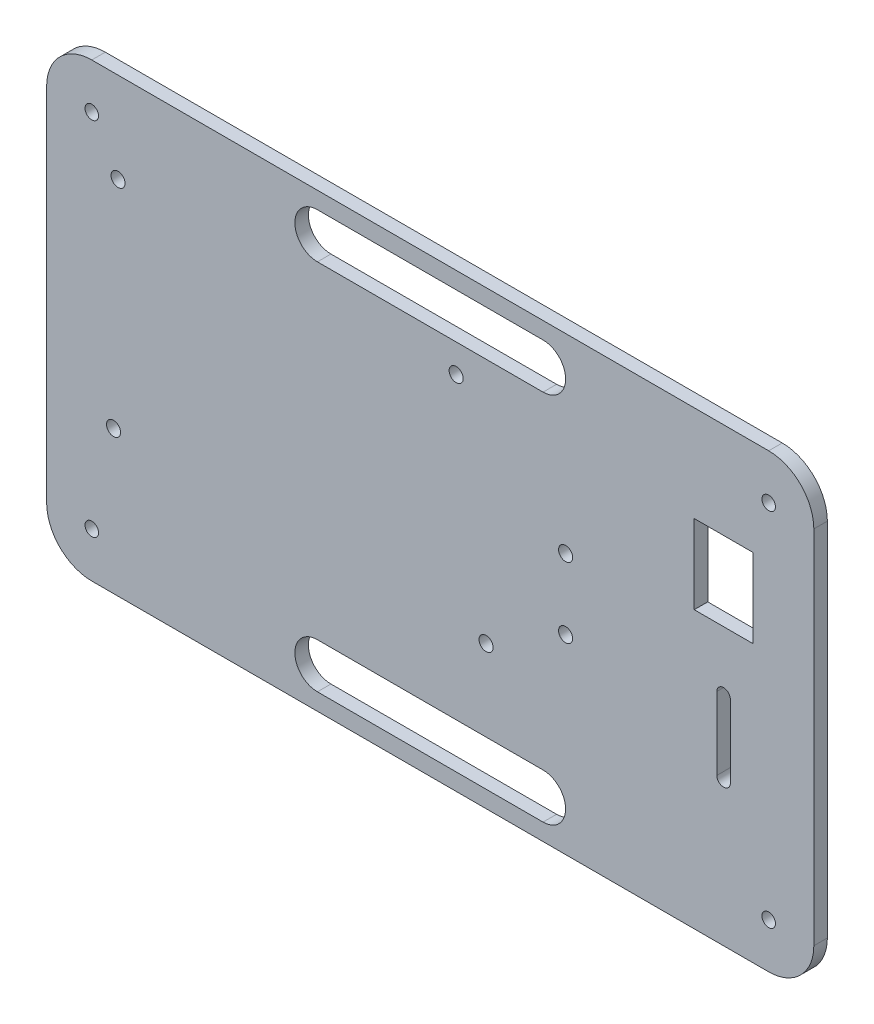
ISO-10303-21;
HEADER;
FILE_DESCRIPTION(('STEP AP214'),'2;1');
FILE_NAME('part.step','',(''),(''),'','','');
FILE_SCHEMA(('AUTOMOTIVE_DESIGN { 1 0 10303 214 1 1 1 1 }'));
ENDSEC;
DATA;
#1=APPLICATION_CONTEXT('core data for automotive mechanical design processes');
#2=APPLICATION_PROTOCOL_DEFINITION('international standard','automotive_design',2000,#1);
#3=PRODUCT_CONTEXT('',#1,'mechanical');
#4=PRODUCT('Part','Part','',(#3));
#5=PRODUCT_RELATED_PRODUCT_CATEGORY('part','',(#4));
#6=PRODUCT_DEFINITION_FORMATION('','',#4);
#7=PRODUCT_DEFINITION_CONTEXT('part definition',#1,'design');
#8=PRODUCT_DEFINITION('design','',#6,#7);
#9=PRODUCT_DEFINITION_SHAPE('','',#8);
#10=(LENGTH_UNIT() NAMED_UNIT(*) SI_UNIT(.MILLI.,.METRE.));
#11=(NAMED_UNIT(*) PLANE_ANGLE_UNIT() SI_UNIT($,.RADIAN.));
#12=(NAMED_UNIT(*) SI_UNIT($,.STERADIAN.) SOLID_ANGLE_UNIT());
#13=UNCERTAINTY_MEASURE_WITH_UNIT(LENGTH_MEASURE(1.E-05),#10,'distance_accuracy_value','');
#14=(GEOMETRIC_REPRESENTATION_CONTEXT(3) GLOBAL_UNCERTAINTY_ASSIGNED_CONTEXT((#13)) GLOBAL_UNIT_ASSIGNED_CONTEXT((#10,
#11,#12)) REPRESENTATION_CONTEXT('',''));
#15=CARTESIAN_POINT('',(0.,0.,0.));
#16=DIRECTION('',(0.,0.,1.));
#17=DIRECTION('',(1.,0.,0.));
#18=AXIS2_PLACEMENT_3D('',#15,#16,#17);
#19=CARTESIAN_POINT('',(75.,40.,3.));
#20=DIRECTION('',(0.,0.,-1.));
#21=DIRECTION('',(-1.,0.,0.));
#22=AXIS2_PLACEMENT_3D('',#19,#20,#21);
#23=PLANE('',#22);
#24=DIRECTION('',(0.,1.,0.));
#25=VECTOR('',#24,1.);
#26=CARTESIAN_POINT('',(71.5,28.75,3.));
#27=LINE('',#26,#25);
#28=CARTESIAN_POINT('',(71.5,11.25,3.));
#29=VERTEX_POINT('',#28);
#30=CARTESIAN_POINT('',(71.5,28.75,3.));
#31=VERTEX_POINT('',#30);
#32=EDGE_CURVE('E232',#29,#31,#27,.T.);
#33=ORIENTED_EDGE('',*,*,#32,.F.);
#34=DIRECTION('',(1.,0.,0.));
#35=VECTOR('',#34,1.);
#36=CARTESIAN_POINT('',(58.5,11.25,3.));
#37=LINE('',#36,#35);
#38=CARTESIAN_POINT('',(58.5,11.25,3.));
#39=VERTEX_POINT('',#38);
#40=EDGE_CURVE('E240',#39,#29,#37,.T.);
#41=ORIENTED_EDGE('',*,*,#40,.F.);
#42=DIRECTION('',(0.,-1.,0.));
#43=VECTOR('',#42,1.);
#44=CARTESIAN_POINT('',(58.5,28.75,3.));
#45=LINE('',#44,#43);
#46=CARTESIAN_POINT('',(58.5,28.75,3.));
#47=VERTEX_POINT('',#46);
#48=EDGE_CURVE('E237',#47,#39,#45,.T.);
#49=ORIENTED_EDGE('',*,*,#48,.F.);
#50=DIRECTION('',(-1.,0.,0.));
#51=VECTOR('',#50,1.);
#52=CARTESIAN_POINT('',(58.5,28.75,3.));
#53=LINE('',#52,#51);
#54=EDGE_CURVE('E234',#31,#47,#53,.T.);
#55=ORIENTED_EDGE('',*,*,#54,.F.);
#56=EDGE_LOOP('',(#33,#41,#49,#55));
#57=FACE_BOUND('',#56,.T.);
#58=CARTESIAN_POINT('',(-25.,41.2578299056687,3.));
#59=DIRECTION('',(0.,0.,1.));
#60=DIRECTION('',(1.,0.,0.));
#61=AXIS2_PLACEMENT_3D('',#58,#59,#60);
#62=CIRCLE('',#61,5.00000000000002);
#63=CARTESIAN_POINT('',(-25.,46.2578299056687,3.));
#64=VERTEX_POINT('',#63);
#65=CARTESIAN_POINT('',(-25.,36.2578299056687,3.));
#66=VERTEX_POINT('',#65);
#67=EDGE_CURVE('E330',#64,#66,#62,.T.);
#68=ORIENTED_EDGE('',*,*,#67,.F.);
#69=DIRECTION('',(-1.,0.,0.));
#70=VECTOR('',#69,1.);
#71=CARTESIAN_POINT('',(-25.,46.2578299056687,3.));
#72=LINE('',#71,#70);
#73=CARTESIAN_POINT('',(25.,46.2578299056687,3.));
#74=VERTEX_POINT('',#73);
#75=EDGE_CURVE('E338',#74,#64,#72,.T.);
#76=ORIENTED_EDGE('',*,*,#75,.F.);
#77=CARTESIAN_POINT('',(25.,41.2578299056687,3.));
#78=DIRECTION('',(0.,0.,1.));
#79=DIRECTION('',(1.,0.,0.));
#80=AXIS2_PLACEMENT_3D('',#77,#78,#79);
#81=CIRCLE('',#80,5.00000000000002);
#82=CARTESIAN_POINT('',(25.,36.2578299056687,3.));
#83=VERTEX_POINT('',#82);
#84=EDGE_CURVE('E335',#83,#74,#81,.T.);
#85=ORIENTED_EDGE('',*,*,#84,.F.);
#86=DIRECTION('',(1.,0.,0.));
#87=VECTOR('',#86,1.);
#88=CARTESIAN_POINT('',(-25.,36.2578299056687,3.));
#89=LINE('',#88,#87);
#90=EDGE_CURVE('E332',#66,#83,#89,.T.);
#91=ORIENTED_EDGE('',*,*,#90,.F.);
#92=EDGE_LOOP('',(#68,#76,#85,#91));
#93=FACE_BOUND('',#92,.T.);
#94=CARTESIAN_POINT('',(75.,40.,3.));
#95=DIRECTION('',(0.,0.,1.));
#96=DIRECTION('',(-1.,0.,0.));
#97=AXIS2_PLACEMENT_3D('',#94,#95,#96);
#98=CIRCLE('',#97,10.);
#99=CARTESIAN_POINT('',(85.,39.9999999999999,3.));
#100=VERTEX_POINT('',#99);
#101=CARTESIAN_POINT('',(74.9999999999999,50.,3.));
#102=VERTEX_POINT('',#101);
#103=EDGE_CURVE('E361',#100,#102,#98,.T.);
#104=ORIENTED_EDGE('',*,*,#103,.T.);
#105=DIRECTION('',(-1.,0.,0.));
#106=VECTOR('',#105,1.);
#107=CARTESIAN_POINT('',(-74.9999999999999,50.,3.));
#108=LINE('',#107,#106);
#109=CARTESIAN_POINT('',(-74.9999999999999,50.,3.));
#110=VERTEX_POINT('',#109);
#111=EDGE_CURVE('E364',#102,#110,#108,.T.);
#112=ORIENTED_EDGE('',*,*,#111,.T.);
#113=CARTESIAN_POINT('',(-75.,40.,3.));
#114=DIRECTION('',(0.,0.,1.));
#115=DIRECTION('',(1.,0.,0.));
#116=AXIS2_PLACEMENT_3D('',#113,#114,#115);
#117=CIRCLE('',#116,10.);
#118=CARTESIAN_POINT('',(-85.,39.9999999999999,3.));
#119=VERTEX_POINT('',#118);
#120=EDGE_CURVE('E367',#110,#119,#117,.T.);
#121=ORIENTED_EDGE('',*,*,#120,.T.);
#122=DIRECTION('',(0.,-1.,0.));
#123=VECTOR('',#122,1.);
#124=CARTESIAN_POINT('',(-85.,39.9999999999999,3.));
#125=LINE('',#124,#123);
#126=CARTESIAN_POINT('',(-85.,-39.9999999999999,3.));
#127=VERTEX_POINT('',#126);
#128=EDGE_CURVE('E369',#119,#127,#125,.T.);
#129=ORIENTED_EDGE('',*,*,#128,.T.);
#130=CARTESIAN_POINT('',(-75.,-40.,3.));
#131=DIRECTION('',(0.,0.,1.));
#132=DIRECTION('',(-1.,0.,0.));
#133=AXIS2_PLACEMENT_3D('',#130,#131,#132);
#134=CIRCLE('',#133,10.);
#135=CARTESIAN_POINT('',(-74.9999999999999,-50.,3.));
#136=VERTEX_POINT('',#135);
#137=EDGE_CURVE('E371',#127,#136,#134,.T.);
#138=ORIENTED_EDGE('',*,*,#137,.T.);
#139=DIRECTION('',(1.,0.,0.));
#140=VECTOR('',#139,1.);
#141=CARTESIAN_POINT('',(-74.9999999999999,-50.,3.));
#142=LINE('',#141,#140);
#143=CARTESIAN_POINT('',(74.9999999999999,-50.,3.));
#144=VERTEX_POINT('',#143);
#145=EDGE_CURVE('E373',#136,#144,#142,.T.);
#146=ORIENTED_EDGE('',*,*,#145,.T.);
#147=CARTESIAN_POINT('',(75.,-40.,3.));
#148=DIRECTION('',(0.,0.,1.));
#149=DIRECTION('',(-1.,0.,0.));
#150=AXIS2_PLACEMENT_3D('',#147,#148,#149);
#151=CIRCLE('',#150,10.);
#152=CARTESIAN_POINT('',(85.,-39.9999999999999,3.));
#153=VERTEX_POINT('',#152);
#154=EDGE_CURVE('E375',#144,#153,#151,.T.);
#155=ORIENTED_EDGE('',*,*,#154,.T.);
#156=DIRECTION('',(0.,1.,0.));
#157=VECTOR('',#156,1.);
#158=CARTESIAN_POINT('',(85.,39.9999999999999,3.));
#159=LINE('',#158,#157);
#160=EDGE_CURVE('E377',#153,#100,#159,.T.);
#161=ORIENTED_EDGE('',*,*,#160,.T.);
#162=EDGE_LOOP('',(#104,#112,#121,#129,#138,#146,#155,#161));
#163=FACE_BOUND('',#162,.T.);
#164=CARTESIAN_POINT('',(-25.,-41.2578299056687,3.));
#165=DIRECTION('',(0.,0.,1.));
#166=DIRECTION('',(-1.,0.,0.));
#167=AXIS2_PLACEMENT_3D('',#164,#165,#166);
#168=CIRCLE('',#167,5.00000000000002);
#169=CARTESIAN_POINT('',(-25.,-36.2578299056687,3.));
#170=VERTEX_POINT('',#169);
#171=CARTESIAN_POINT('',(-25.,-46.2578299056687,3.));
#172=VERTEX_POINT('',#171);
#173=EDGE_CURVE('E299',#170,#172,#168,.T.);
#174=ORIENTED_EDGE('',*,*,#173,.F.);
#175=DIRECTION('',(-1.,0.,0.));
#176=VECTOR('',#175,1.);
#177=CARTESIAN_POINT('',(-25.,-36.2578299056687,3.));
#178=LINE('',#177,#176);
#179=CARTESIAN_POINT('',(25.,-36.2578299056687,3.));
#180=VERTEX_POINT('',#179);
#181=EDGE_CURVE('E307',#180,#170,#178,.T.);
#182=ORIENTED_EDGE('',*,*,#181,.F.);
#183=CARTESIAN_POINT('',(25.,-41.2578299056687,3.));
#184=DIRECTION('',(0.,0.,1.));
#185=DIRECTION('',(-1.,0.,0.));
#186=AXIS2_PLACEMENT_3D('',#183,#184,#185);
#187=CIRCLE('',#186,5.00000000000002);
#188=CARTESIAN_POINT('',(25.,-46.2578299056687,3.));
#189=VERTEX_POINT('',#188);
#190=EDGE_CURVE('E304',#189,#180,#187,.T.);
#191=ORIENTED_EDGE('',*,*,#190,.F.);
#192=DIRECTION('',(1.,0.,0.));
#193=VECTOR('',#192,1.);
#194=CARTESIAN_POINT('',(-25.,-46.2578299056687,3.));
#195=LINE('',#194,#193);
#196=EDGE_CURVE('E301',#172,#189,#195,.T.);
#197=ORIENTED_EDGE('',*,*,#196,.F.);
#198=EDGE_LOOP('',(#174,#182,#191,#197));
#199=FACE_BOUND('',#198,.T.);
#200=CARTESIAN_POINT('',(-69.18,29.9999999999999,3.));
#201=DIRECTION('',(0.,0.,1.));
#202=DIRECTION('',(1.,0.,0.));
#203=AXIS2_PLACEMENT_3D('',#200,#201,#202);
#204=CIRCLE('',#203,1.56);
#205=CARTESIAN_POINT('',(-67.62,29.9999999999999,3.));
#206=VERTEX_POINT('',#205);
#207=EDGE_CURVE('E293',#206,#206,#204,.T.);
#208=ORIENTED_EDGE('',*,*,#207,.F.);
#209=EDGE_LOOP('',(#208));
#210=FACE_BOUND('',#209,.T.);
#211=CARTESIAN_POINT('',(5.75000000000003,30.,3.));
#212=DIRECTION('',(0.,0.,1.));
#213=DIRECTION('',(1.,0.,0.));
#214=AXIS2_PLACEMENT_3D('',#211,#212,#213);
#215=CIRCLE('',#214,1.56);
#216=CARTESIAN_POINT('',(7.31000000000003,30.,3.));
#217=VERTEX_POINT('',#216);
#218=EDGE_CURVE('E287',#217,#217,#215,.T.);
#219=ORIENTED_EDGE('',*,*,#218,.F.);
#220=EDGE_LOOP('',(#219));
#221=FACE_BOUND('',#220,.T.);
#222=CARTESIAN_POINT('',(12.37,-18.3,3.));
#223=DIRECTION('',(0.,0.,1.));
#224=DIRECTION('',(1.,0.,0.));
#225=AXIS2_PLACEMENT_3D('',#222,#223,#224);
#226=CIRCLE('',#225,1.56);
#227=CARTESIAN_POINT('',(13.93,-18.3,3.));
#228=VERTEX_POINT('',#227);
#229=EDGE_CURVE('E281',#228,#228,#226,.T.);
#230=ORIENTED_EDGE('',*,*,#229,.F.);
#231=EDGE_LOOP('',(#230));
#232=FACE_BOUND('',#231,.T.);
#233=CARTESIAN_POINT('',(-70.18,-18.3,3.));
#234=DIRECTION('',(0.,0.,1.));
#235=DIRECTION('',(1.,0.,0.));
#236=AXIS2_PLACEMENT_3D('',#233,#234,#235);
#237=CIRCLE('',#236,1.56);
#238=CARTESIAN_POINT('',(-68.62,-18.3,3.));
#239=VERTEX_POINT('',#238);
#240=EDGE_CURVE('E275',#239,#239,#237,.T.);
#241=ORIENTED_EDGE('',*,*,#240,.F.);
#242=EDGE_LOOP('',(#241));
#243=FACE_BOUND('',#242,.T.);
#244=CARTESIAN_POINT('',(30.,-7.78,3.));
#245=DIRECTION('',(0.,0.,1.));
#246=DIRECTION('',(1.,0.,0.));
#247=AXIS2_PLACEMENT_3D('',#244,#245,#246);
#248=CIRCLE('',#247,1.56);
#249=CARTESIAN_POINT('',(31.56,-7.78,3.));
#250=VERTEX_POINT('',#249);
#251=EDGE_CURVE('E269',#250,#250,#248,.T.);
#252=ORIENTED_EDGE('',*,*,#251,.F.);
#253=EDGE_LOOP('',(#252));
#254=FACE_BOUND('',#253,.T.);
#255=CARTESIAN_POINT('',(30.,7.78,3.));
#256=DIRECTION('',(0.,0.,1.));
#257=DIRECTION('',(1.,0.,0.));
#258=AXIS2_PLACEMENT_3D('',#255,#256,#257);
#259=CIRCLE('',#258,1.55999999999999);
#260=CARTESIAN_POINT('',(31.56,7.78,3.));
#261=VERTEX_POINT('',#260);
#262=EDGE_CURVE('E263',#261,#261,#259,.T.);
#263=ORIENTED_EDGE('',*,*,#262,.F.);
#264=EDGE_LOOP('',(#263));
#265=FACE_BOUND('',#264,.T.);
#266=CARTESIAN_POINT('',(65.,-1.94999999999999,3.));
#267=DIRECTION('',(0.,0.,1.));
#268=DIRECTION('',(1.,0.,0.));
#269=AXIS2_PLACEMENT_3D('',#266,#267,#268);
#270=CIRCLE('',#269,1.49999999999992);
#271=CARTESIAN_POINT('',(66.4999999999999,-1.94999999999999,3.));
#272=VERTEX_POINT('',#271);
#273=CARTESIAN_POINT('',(63.5,-1.94999999999999,3.));
#274=VERTEX_POINT('',#273);
#275=EDGE_CURVE('E193',#272,#274,#270,.T.);
#276=ORIENTED_EDGE('',*,*,#275,.F.);
#277=DIRECTION('',(0.,1.,0.));
#278=VECTOR('',#277,1.);
#279=CARTESIAN_POINT('',(66.4999999999999,-1.94999999999999,3.));
#280=LINE('',#279,#278);
#281=CARTESIAN_POINT('',(66.4999999999999,-18.05,3.));
#282=VERTEX_POINT('',#281);
#283=EDGE_CURVE('E216',#282,#272,#280,.T.);
#284=ORIENTED_EDGE('',*,*,#283,.F.);
#285=CARTESIAN_POINT('',(65.,-18.05,3.));
#286=DIRECTION('',(0.,0.,1.));
#287=DIRECTION('',(1.,0.,0.));
#288=AXIS2_PLACEMENT_3D('',#285,#286,#287);
#289=CIRCLE('',#288,1.49999999999992);
#290=CARTESIAN_POINT('',(63.5000000000001,-18.05,3.));
#291=VERTEX_POINT('',#290);
#292=EDGE_CURVE('E214',#291,#282,#289,.T.);
#293=ORIENTED_EDGE('',*,*,#292,.F.);
#294=DIRECTION('',(0.,-1.,0.));
#295=VECTOR('',#294,1.);
#296=CARTESIAN_POINT('',(63.5,-1.94999999999999,3.));
#297=LINE('',#296,#295);
#298=EDGE_CURVE('E201',#274,#291,#297,.T.);
#299=ORIENTED_EDGE('',*,*,#298,.F.);
#300=EDGE_LOOP('',(#276,#284,#293,#299));
#301=FACE_BOUND('',#300,.T.);
#302=CARTESIAN_POINT('',(-75.,40.,3.));
#303=DIRECTION('',(0.,0.,1.));
#304=DIRECTION('',(1.,0.,0.));
#305=AXIS2_PLACEMENT_3D('',#302,#303,#304);
#306=CIRCLE('',#305,1.5);
#307=CARTESIAN_POINT('',(-73.5,40.,3.));
#308=VERTEX_POINT('',#307);
#309=EDGE_CURVE('E222',#308,#308,#306,.T.);
#310=ORIENTED_EDGE('',*,*,#309,.F.);
#311=EDGE_LOOP('',(#310));
#312=FACE_BOUND('',#311,.T.);
#313=CARTESIAN_POINT('',(-75.,-40.,3.));
#314=DIRECTION('',(0.,0.,1.));
#315=DIRECTION('',(1.,0.,0.));
#316=AXIS2_PLACEMENT_3D('',#313,#314,#315);
#317=CIRCLE('',#316,1.49999999999998);
#318=CARTESIAN_POINT('',(-73.5,-40.,3.));
#319=VERTEX_POINT('',#318);
#320=EDGE_CURVE('E609',#319,#319,#317,.T.);
#321=ORIENTED_EDGE('',*,*,#320,.F.);
#322=EDGE_LOOP('',(#321));
#323=FACE_BOUND('',#322,.T.);
#324=CARTESIAN_POINT('',(75.,-40.,3.));
#325=DIRECTION('',(0.,0.,1.));
#326=DIRECTION('',(1.,0.,0.));
#327=AXIS2_PLACEMENT_3D('',#324,#325,#326);
#328=CIRCLE('',#327,1.5);
#329=CARTESIAN_POINT('',(76.5,-40.,3.));
#330=VERTEX_POINT('',#329);
#331=EDGE_CURVE('E603',#330,#330,#328,.T.);
#332=ORIENTED_EDGE('',*,*,#331,.F.);
#333=EDGE_LOOP('',(#332));
#334=FACE_BOUND('',#333,.T.);
#335=CARTESIAN_POINT('',(75.,40.,3.));
#336=DIRECTION('',(0.,0.,1.));
#337=DIRECTION('',(1.,0.,0.));
#338=AXIS2_PLACEMENT_3D('',#335,#336,#337);
#339=CIRCLE('',#338,1.5);
#340=CARTESIAN_POINT('',(76.5,40.,3.));
#341=VERTEX_POINT('',#340);
#342=EDGE_CURVE('E594',#341,#341,#339,.T.);
#343=ORIENTED_EDGE('',*,*,#342,.F.);
#344=EDGE_LOOP('',(#343));
#345=FACE_BOUND('',#344,.T.);
#346=ADVANCED_FACE('F32',(#57,#93,#163,#199,#210,#221,#232,#243,#254,#265,#301,#312,#323,#334,
#345),#23,.F.);
#347=CARTESIAN_POINT('',(75.,40.,0.));
#348=DIRECTION('',(0.,0.,-1.));
#349=DIRECTION('',(-1.,0.,0.));
#350=AXIS2_PLACEMENT_3D('',#347,#348,#349);
#351=PLANE('',#350);
#352=CARTESIAN_POINT('',(75.,-40.,0.));
#353=DIRECTION('',(0.,0.,1.));
#354=DIRECTION('',(1.,0.,0.));
#355=AXIS2_PLACEMENT_3D('',#352,#353,#354);
#356=CIRCLE('',#355,1.5);
#357=CARTESIAN_POINT('',(76.5,-40.,0.));
#358=VERTEX_POINT('',#357);
#359=EDGE_CURVE('E600',#358,#358,#356,.T.);
#360=ORIENTED_EDGE('',*,*,#359,.T.);
#361=EDGE_LOOP('',(#360));
#362=FACE_BOUND('',#361,.T.);
#363=CARTESIAN_POINT('',(-75.,40.,0.));
#364=DIRECTION('',(0.,0.,1.));
#365=DIRECTION('',(1.,0.,0.));
#366=AXIS2_PLACEMENT_3D('',#363,#364,#365);
#367=CIRCLE('',#366,1.5);
#368=CARTESIAN_POINT('',(-73.5,40.,0.));
#369=VERTEX_POINT('',#368);
#370=EDGE_CURVE('E612',#369,#369,#367,.T.);
#371=ORIENTED_EDGE('',*,*,#370,.T.);
#372=EDGE_LOOP('',(#371));
#373=FACE_BOUND('',#372,.T.);
#374=CARTESIAN_POINT('',(30.,-7.78,0.));
#375=DIRECTION('',(0.,0.,1.));
#376=DIRECTION('',(1.,0.,0.));
#377=AXIS2_PLACEMENT_3D('',#374,#375,#376);
#378=CIRCLE('',#377,1.56);
#379=CARTESIAN_POINT('',(31.56,-7.78,0.));
#380=VERTEX_POINT('',#379);
#381=EDGE_CURVE('E266',#380,#380,#378,.T.);
#382=ORIENTED_EDGE('',*,*,#381,.T.);
#383=EDGE_LOOP('',(#382));
#384=FACE_BOUND('',#383,.T.);
#385=CARTESIAN_POINT('',(12.37,-18.3,0.));
#386=DIRECTION('',(0.,0.,1.));
#387=DIRECTION('',(1.,0.,0.));
#388=AXIS2_PLACEMENT_3D('',#385,#386,#387);
#389=CIRCLE('',#388,1.56);
#390=CARTESIAN_POINT('',(13.93,-18.3,0.));
#391=VERTEX_POINT('',#390);
#392=EDGE_CURVE('E278',#391,#391,#389,.T.);
#393=ORIENTED_EDGE('',*,*,#392,.T.);
#394=EDGE_LOOP('',(#393));
#395=FACE_BOUND('',#394,.T.);
#396=CARTESIAN_POINT('',(-69.18,29.9999999999999,0.));
#397=DIRECTION('',(0.,0.,1.));
#398=DIRECTION('',(1.,0.,0.));
#399=AXIS2_PLACEMENT_3D('',#396,#397,#398);
#400=CIRCLE('',#399,1.56);
#401=CARTESIAN_POINT('',(-67.62,29.9999999999999,0.));
#402=VERTEX_POINT('',#401);
#403=EDGE_CURVE('E290',#402,#402,#400,.T.);
#404=ORIENTED_EDGE('',*,*,#403,.T.);
#405=EDGE_LOOP('',(#404));
#406=FACE_BOUND('',#405,.T.);
#407=CARTESIAN_POINT('',(75.,40.,0.));
#408=DIRECTION('',(0.,0.,1.));
#409=DIRECTION('',(-1.,0.,0.));
#410=AXIS2_PLACEMENT_3D('',#407,#408,#409);
#411=CIRCLE('',#410,10.);
#412=CARTESIAN_POINT('',(85.,39.9999999999999,0.));
#413=VERTEX_POINT('',#412);
#414=CARTESIAN_POINT('',(74.9999999999999,50.,0.));
#415=VERTEX_POINT('',#414);
#416=EDGE_CURVE('E360',#413,#415,#411,.T.);
#417=ORIENTED_EDGE('',*,*,#416,.F.);
#418=DIRECTION('',(0.,1.,0.));
#419=VECTOR('',#418,1.);
#420=CARTESIAN_POINT('',(85.,39.9999999999999,0.));
#421=LINE('',#420,#419);
#422=CARTESIAN_POINT('',(85.,-39.9999999999999,0.));
#423=VERTEX_POINT('',#422);
#424=EDGE_CURVE('E365',#423,#413,#421,.T.);
#425=ORIENTED_EDGE('',*,*,#424,.F.);
#426=CARTESIAN_POINT('',(75.,-40.,0.));
#427=DIRECTION('',(0.,0.,1.));
#428=DIRECTION('',(-1.,0.,0.));
#429=AXIS2_PLACEMENT_3D('',#426,#427,#428);
#430=CIRCLE('',#429,10.);
#431=CARTESIAN_POINT('',(74.9999999999999,-50.,0.));
#432=VERTEX_POINT('',#431);
#433=EDGE_CURVE('E392',#432,#423,#430,.T.);
#434=ORIENTED_EDGE('',*,*,#433,.F.);
#435=DIRECTION('',(1.,0.,0.));
#436=VECTOR('',#435,1.);
#437=CARTESIAN_POINT('',(-74.9999999999999,-50.,0.));
#438=LINE('',#437,#436);
#439=CARTESIAN_POINT('',(-74.9999999999999,-50.,0.));
#440=VERTEX_POINT('',#439);
#441=EDGE_CURVE('E390',#440,#432,#438,.T.);
#442=ORIENTED_EDGE('',*,*,#441,.F.);
#443=CARTESIAN_POINT('',(-75.,-40.,0.));
#444=DIRECTION('',(0.,0.,1.));
#445=DIRECTION('',(-1.,0.,0.));
#446=AXIS2_PLACEMENT_3D('',#443,#444,#445);
#447=CIRCLE('',#446,10.);
#448=CARTESIAN_POINT('',(-85.,-39.9999999999999,0.));
#449=VERTEX_POINT('',#448);
#450=EDGE_CURVE('E388',#449,#440,#447,.T.);
#451=ORIENTED_EDGE('',*,*,#450,.F.);
#452=DIRECTION('',(0.,-1.,0.));
#453=VECTOR('',#452,1.);
#454=CARTESIAN_POINT('',(-85.,39.9999999999999,0.));
#455=LINE('',#454,#453);
#456=CARTESIAN_POINT('',(-85.,39.9999999999999,0.));
#457=VERTEX_POINT('',#456);
#458=EDGE_CURVE('E386',#457,#449,#455,.T.);
#459=ORIENTED_EDGE('',*,*,#458,.F.);
#460=CARTESIAN_POINT('',(-75.,40.,0.));
#461=DIRECTION('',(0.,0.,1.));
#462=DIRECTION('',(1.,0.,0.));
#463=AXIS2_PLACEMENT_3D('',#460,#461,#462);
#464=CIRCLE('',#463,10.);
#465=CARTESIAN_POINT('',(-74.9999999999999,50.,0.));
#466=VERTEX_POINT('',#465);
#467=EDGE_CURVE('E384',#466,#457,#464,.T.);
#468=ORIENTED_EDGE('',*,*,#467,.F.);
#469=DIRECTION('',(-1.,0.,0.));
#470=VECTOR('',#469,1.);
#471=CARTESIAN_POINT('',(-74.9999999999999,50.,0.));
#472=LINE('',#471,#470);
#473=EDGE_CURVE('E382',#415,#466,#472,.T.);
#474=ORIENTED_EDGE('',*,*,#473,.F.);
#475=EDGE_LOOP('',(#417,#425,#434,#442,#451,#459,#468,#474));
#476=FACE_BOUND('',#475,.T.);
#477=DIRECTION('',(-1.,0.,0.));
#478=VECTOR('',#477,1.);
#479=CARTESIAN_POINT('',(-25.,46.2578299056687,0.));
#480=LINE('',#479,#478);
#481=CARTESIAN_POINT('',(25.,46.2578299056687,0.));
#482=VERTEX_POINT('',#481);
#483=CARTESIAN_POINT('',(-25.,46.2578299056687,0.));
#484=VERTEX_POINT('',#483);
#485=EDGE_CURVE('E333',#482,#484,#480,.T.);
#486=ORIENTED_EDGE('',*,*,#485,.T.);
#487=CARTESIAN_POINT('',(-25.,41.2578299056687,0.));
#488=DIRECTION('',(0.,0.,1.));
#489=DIRECTION('',(1.,0.,0.));
#490=AXIS2_PLACEMENT_3D('',#487,#488,#489);
#491=CIRCLE('',#490,5.00000000000002);
#492=CARTESIAN_POINT('',(-25.,36.2578299056687,0.));
#493=VERTEX_POINT('',#492);
#494=EDGE_CURVE('E329',#484,#493,#491,.T.);
#495=ORIENTED_EDGE('',*,*,#494,.T.);
#496=DIRECTION('',(1.,0.,0.));
#497=VECTOR('',#496,1.);
#498=CARTESIAN_POINT('',(-25.,36.2578299056687,0.));
#499=LINE('',#498,#497);
#500=CARTESIAN_POINT('',(25.,36.2578299056687,0.));
#501=VERTEX_POINT('',#500);
#502=EDGE_CURVE('E343',#493,#501,#499,.T.);
#503=ORIENTED_EDGE('',*,*,#502,.T.);
#504=CARTESIAN_POINT('',(25.,41.2578299056687,0.));
#505=DIRECTION('',(0.,0.,1.));
#506=DIRECTION('',(1.,0.,0.));
#507=AXIS2_PLACEMENT_3D('',#504,#505,#506);
#508=CIRCLE('',#507,5.00000000000002);
#509=EDGE_CURVE('E346',#501,#482,#508,.T.);
#510=ORIENTED_EDGE('',*,*,#509,.T.);
#511=EDGE_LOOP('',(#486,#495,#503,#510));
#512=FACE_BOUND('',#511,.T.);
#513=DIRECTION('',(-1.,0.,0.));
#514=VECTOR('',#513,1.);
#515=CARTESIAN_POINT('',(-25.,-36.2578299056687,0.));
#516=LINE('',#515,#514);
#517=CARTESIAN_POINT('',(25.,-36.2578299056687,0.));
#518=VERTEX_POINT('',#517);
#519=CARTESIAN_POINT('',(-25.,-36.2578299056687,0.));
#520=VERTEX_POINT('',#519);
#521=EDGE_CURVE('E302',#518,#520,#516,.T.);
#522=ORIENTED_EDGE('',*,*,#521,.T.);
#523=CARTESIAN_POINT('',(-25.,-41.2578299056687,0.));
#524=DIRECTION('',(0.,0.,1.));
#525=DIRECTION('',(-1.,0.,0.));
#526=AXIS2_PLACEMENT_3D('',#523,#524,#525);
#527=CIRCLE('',#526,5.00000000000002);
#528=CARTESIAN_POINT('',(-25.,-46.2578299056687,0.));
#529=VERTEX_POINT('',#528);
#530=EDGE_CURVE('E296',#520,#529,#527,.T.);
#531=ORIENTED_EDGE('',*,*,#530,.T.);
#532=DIRECTION('',(1.,0.,0.));
#533=VECTOR('',#532,1.);
#534=CARTESIAN_POINT('',(-25.,-46.2578299056687,0.));
#535=LINE('',#534,#533);
#536=CARTESIAN_POINT('',(25.,-46.2578299056687,0.));
#537=VERTEX_POINT('',#536);
#538=EDGE_CURVE('E312',#529,#537,#535,.T.);
#539=ORIENTED_EDGE('',*,*,#538,.T.);
#540=CARTESIAN_POINT('',(25.,-41.2578299056687,0.));
#541=DIRECTION('',(0.,0.,1.));
#542=DIRECTION('',(-1.,0.,0.));
#543=AXIS2_PLACEMENT_3D('',#540,#541,#542);
#544=CIRCLE('',#543,5.00000000000002);
#545=EDGE_CURVE('E315',#537,#518,#544,.T.);
#546=ORIENTED_EDGE('',*,*,#545,.T.);
#547=EDGE_LOOP('',(#522,#531,#539,#546));
#548=FACE_BOUND('',#547,.T.);
#549=CARTESIAN_POINT('',(5.75000000000003,30.,0.));
#550=DIRECTION('',(0.,0.,1.));
#551=DIRECTION('',(1.,0.,0.));
#552=AXIS2_PLACEMENT_3D('',#549,#550,#551);
#553=CIRCLE('',#552,1.56);
#554=CARTESIAN_POINT('',(7.31000000000003,30.,0.));
#555=VERTEX_POINT('',#554);
#556=EDGE_CURVE('E284',#555,#555,#553,.T.);
#557=ORIENTED_EDGE('',*,*,#556,.T.);
#558=EDGE_LOOP('',(#557));
#559=FACE_BOUND('',#558,.T.);
#560=CARTESIAN_POINT('',(-70.18,-18.3,0.));
#561=DIRECTION('',(0.,0.,1.));
#562=DIRECTION('',(1.,0.,0.));
#563=AXIS2_PLACEMENT_3D('',#560,#561,#562);
#564=CIRCLE('',#563,1.56);
#565=CARTESIAN_POINT('',(-68.62,-18.3,0.));
#566=VERTEX_POINT('',#565);
#567=EDGE_CURVE('E272',#566,#566,#564,.T.);
#568=ORIENTED_EDGE('',*,*,#567,.T.);
#569=EDGE_LOOP('',(#568));
#570=FACE_BOUND('',#569,.T.);
#571=CARTESIAN_POINT('',(30.,7.78,0.));
#572=DIRECTION('',(0.,0.,1.));
#573=DIRECTION('',(1.,0.,0.));
#574=AXIS2_PLACEMENT_3D('',#571,#572,#573);
#575=CIRCLE('',#574,1.55999999999999);
#576=CARTESIAN_POINT('',(31.56,7.78,0.));
#577=VERTEX_POINT('',#576);
#578=EDGE_CURVE('E262',#577,#577,#575,.T.);
#579=ORIENTED_EDGE('',*,*,#578,.T.);
#580=EDGE_LOOP('',(#579));
#581=FACE_BOUND('',#580,.T.);
#582=DIRECTION('',(1.,0.,0.));
#583=VECTOR('',#582,1.);
#584=CARTESIAN_POINT('',(58.5,11.25,0.));
#585=LINE('',#584,#583);
#586=CARTESIAN_POINT('',(58.5,11.25,0.));
#587=VERTEX_POINT('',#586);
#588=CARTESIAN_POINT('',(71.5,11.25,0.));
#589=VERTEX_POINT('',#588);
#590=EDGE_CURVE('E235',#587,#589,#585,.T.);
#591=ORIENTED_EDGE('',*,*,#590,.T.);
#592=DIRECTION('',(0.,1.,0.));
#593=VECTOR('',#592,1.);
#594=CARTESIAN_POINT('',(71.5,28.75,0.));
#595=LINE('',#594,#593);
#596=CARTESIAN_POINT('',(71.5,28.75,0.));
#597=VERTEX_POINT('',#596);
#598=EDGE_CURVE('E209',#589,#597,#595,.T.);
#599=ORIENTED_EDGE('',*,*,#598,.T.);
#600=DIRECTION('',(-1.,0.,0.));
#601=VECTOR('',#600,1.);
#602=CARTESIAN_POINT('',(58.5,28.75,0.));
#603=LINE('',#602,#601);
#604=CARTESIAN_POINT('',(58.5,28.75,0.));
#605=VERTEX_POINT('',#604);
#606=EDGE_CURVE('E245',#597,#605,#603,.T.);
#607=ORIENTED_EDGE('',*,*,#606,.T.);
#608=DIRECTION('',(0.,-1.,0.));
#609=VECTOR('',#608,1.);
#610=CARTESIAN_POINT('',(58.5,28.75,0.));
#611=LINE('',#610,#609);
#612=EDGE_CURVE('E248',#605,#587,#611,.T.);
#613=ORIENTED_EDGE('',*,*,#612,.T.);
#614=EDGE_LOOP('',(#591,#599,#607,#613));
#615=FACE_BOUND('',#614,.T.);
#616=DIRECTION('',(0.,1.,0.));
#617=VECTOR('',#616,1.);
#618=CARTESIAN_POINT('',(66.4999999999999,-1.94999999999999,0.));
#619=LINE('',#618,#617);
#620=CARTESIAN_POINT('',(66.4999999999999,-18.05,0.));
#621=VERTEX_POINT('',#620);
#622=CARTESIAN_POINT('',(66.4999999999999,-1.94999999999999,0.));
#623=VERTEX_POINT('',#622);
#624=EDGE_CURVE('E202',#621,#623,#619,.T.);
#625=ORIENTED_EDGE('',*,*,#624,.T.);
#626=CARTESIAN_POINT('',(65.,-1.94999999999999,0.));
#627=DIRECTION('',(0.,0.,1.));
#628=DIRECTION('',(1.,0.,0.));
#629=AXIS2_PLACEMENT_3D('',#626,#627,#628);
#630=CIRCLE('',#629,1.49999999999992);
#631=CARTESIAN_POINT('',(63.5,-1.94999999999999,0.));
#632=VERTEX_POINT('',#631);
#633=EDGE_CURVE('E55',#623,#632,#630,.T.);
#634=ORIENTED_EDGE('',*,*,#633,.T.);
#635=DIRECTION('',(0.,-1.,0.));
#636=VECTOR('',#635,1.);
#637=CARTESIAN_POINT('',(63.5,-1.94999999999999,0.));
#638=LINE('',#637,#636);
#639=CARTESIAN_POINT('',(63.5000000000001,-18.05,0.));
#640=VERTEX_POINT('',#639);
#641=EDGE_CURVE('E208',#632,#640,#638,.T.);
#642=ORIENTED_EDGE('',*,*,#641,.T.);
#643=CARTESIAN_POINT('',(65.,-18.05,0.));
#644=DIRECTION('',(0.,0.,1.));
#645=DIRECTION('',(1.,0.,0.));
#646=AXIS2_PLACEMENT_3D('',#643,#644,#645);
#647=CIRCLE('',#646,1.49999999999992);
#648=EDGE_CURVE('E224',#640,#621,#647,.T.);
#649=ORIENTED_EDGE('',*,*,#648,.T.);
#650=EDGE_LOOP('',(#625,#634,#642,#649));
#651=FACE_BOUND('',#650,.T.);
#652=CARTESIAN_POINT('',(-75.,-40.,0.));
#653=DIRECTION('',(0.,0.,1.));
#654=DIRECTION('',(1.,0.,0.));
#655=AXIS2_PLACEMENT_3D('',#652,#653,#654);
#656=CIRCLE('',#655,1.49999999999998);
#657=CARTESIAN_POINT('',(-73.5,-40.,0.));
#658=VERTEX_POINT('',#657);
#659=EDGE_CURVE('E606',#658,#658,#656,.T.);
#660=ORIENTED_EDGE('',*,*,#659,.T.);
#661=EDGE_LOOP('',(#660));
#662=FACE_BOUND('',#661,.T.);
#663=CARTESIAN_POINT('',(75.,40.,0.));
#664=DIRECTION('',(0.,0.,1.));
#665=DIRECTION('',(1.,0.,0.));
#666=AXIS2_PLACEMENT_3D('',#663,#664,#665);
#667=CIRCLE('',#666,1.5);
#668=CARTESIAN_POINT('',(76.5,40.,0.));
#669=VERTEX_POINT('',#668);
#670=EDGE_CURVE('E597',#669,#669,#667,.T.);
#671=ORIENTED_EDGE('',*,*,#670,.T.);
#672=EDGE_LOOP('',(#671));
#673=FACE_BOUND('',#672,.T.);
#674=ADVANCED_FACE('F422',(#362,#373,#384,#395,#406,#476,#512,#548,#559,#570,#581,#615,#651,
#662,#673),#351,.T.);
#675=CARTESIAN_POINT('',(75.,40.,3.));
#676=DIRECTION('',(0.,0.,-1.));
#677=DIRECTION('',(-1.,0.,0.));
#678=AXIS2_PLACEMENT_3D('',#675,#676,#677);
#679=CYLINDRICAL_SURFACE('',#678,10.);
#680=ORIENTED_EDGE('',*,*,#416,.T.);
#681=DIRECTION('',(0.,0.,-1.));
#682=VECTOR('',#681,1.);
#683=CARTESIAN_POINT('',(74.9999999999999,50.,3.));
#684=LINE('',#683,#682);
#685=EDGE_CURVE('E11',#102,#415,#684,.T.);
#686=ORIENTED_EDGE('',*,*,#685,.F.);
#687=ORIENTED_EDGE('',*,*,#103,.F.);
#688=DIRECTION('',(0.,0.,-1.));
#689=VECTOR('',#688,1.);
#690=CARTESIAN_POINT('',(85.,39.9999999999999,3.));
#691=LINE('',#690,#689);
#692=EDGE_CURVE('E379',#100,#413,#691,.T.);
#693=ORIENTED_EDGE('',*,*,#692,.T.);
#694=EDGE_LOOP('',(#680,#686,#687,#693));
#695=FACE_BOUND('',#694,.T.);
#696=ADVANCED_FACE('F34',(#695),#679,.T.);
#697=CARTESIAN_POINT('',(-74.9999999999999,50.,3.));
#698=DIRECTION('',(0.,-1.,0.));
#699=DIRECTION('',(0.,0.,-1.));
#700=AXIS2_PLACEMENT_3D('',#697,#698,#699);
#701=PLANE('',#700);
#702=ORIENTED_EDGE('',*,*,#473,.T.);
#703=DIRECTION('',(0.,0.,-1.));
#704=VECTOR('',#703,1.);
#705=CARTESIAN_POINT('',(-74.9999999999999,50.,3.));
#706=LINE('',#705,#704);
#707=EDGE_CURVE('E40',#110,#466,#706,.T.);
#708=ORIENTED_EDGE('',*,*,#707,.F.);
#709=ORIENTED_EDGE('',*,*,#111,.F.);
#710=ORIENTED_EDGE('',*,*,#685,.T.);
#711=EDGE_LOOP('',(#702,#708,#709,#710));
#712=FACE_BOUND('',#711,.T.);
#713=ADVANCED_FACE('F440',(#712),#701,.F.);
#714=CARTESIAN_POINT('',(-75.,40.,3.));
#715=DIRECTION('',(0.,0.,-1.));
#716=DIRECTION('',(-1.,0.,0.));
#717=AXIS2_PLACEMENT_3D('',#714,#715,#716);
#718=CYLINDRICAL_SURFACE('',#717,10.);
#719=ORIENTED_EDGE('',*,*,#467,.T.);
#720=DIRECTION('',(0.,0.,-1.));
#721=VECTOR('',#720,1.);
#722=CARTESIAN_POINT('',(-85.,39.9999999999999,3.));
#723=LINE('',#722,#721);
#724=EDGE_CURVE('E409',#119,#457,#723,.T.);
#725=ORIENTED_EDGE('',*,*,#724,.F.);
#726=ORIENTED_EDGE('',*,*,#120,.F.);
#727=ORIENTED_EDGE('',*,*,#707,.T.);
#728=EDGE_LOOP('',(#719,#725,#726,#727));
#729=FACE_BOUND('',#728,.T.);
#730=ADVANCED_FACE('F416',(#729),#718,.T.);
#731=CARTESIAN_POINT('',(-85.,39.9999999999999,3.));
#732=DIRECTION('',(1.,0.,0.));
#733=DIRECTION('',(0.,1.,0.));
#734=AXIS2_PLACEMENT_3D('',#731,#732,#733);
#735=PLANE('',#734);
#736=ORIENTED_EDGE('',*,*,#458,.T.);
#737=DIRECTION('',(0.,0.,-1.));
#738=VECTOR('',#737,1.);
#739=CARTESIAN_POINT('',(-85.,-39.9999999999999,3.));
#740=LINE('',#739,#738);
#741=EDGE_CURVE('E406',#127,#449,#740,.T.);
#742=ORIENTED_EDGE('',*,*,#741,.F.);
#743=ORIENTED_EDGE('',*,*,#128,.F.);
#744=ORIENTED_EDGE('',*,*,#724,.T.);
#745=EDGE_LOOP('',(#736,#742,#743,#744));
#746=FACE_BOUND('',#745,.T.);
#747=ADVANCED_FACE('F428',(#746),#735,.F.);
#748=CARTESIAN_POINT('',(-75.,-40.,3.));
#749=DIRECTION('',(0.,0.,-1.));
#750=DIRECTION('',(-1.,0.,0.));
#751=AXIS2_PLACEMENT_3D('',#748,#749,#750);
#752=CYLINDRICAL_SURFACE('',#751,10.);
#753=ORIENTED_EDGE('',*,*,#450,.T.);
#754=DIRECTION('',(0.,0.,-1.));
#755=VECTOR('',#754,1.);
#756=CARTESIAN_POINT('',(-74.9999999999999,-50.,3.));
#757=LINE('',#756,#755);
#758=EDGE_CURVE('E403',#136,#440,#757,.T.);
#759=ORIENTED_EDGE('',*,*,#758,.F.);
#760=ORIENTED_EDGE('',*,*,#137,.F.);
#761=ORIENTED_EDGE('',*,*,#741,.T.);
#762=EDGE_LOOP('',(#753,#759,#760,#761));
#763=FACE_BOUND('',#762,.T.);
#764=ADVANCED_FACE('F432',(#763),#752,.T.);
#765=CARTESIAN_POINT('',(-74.9999999999999,-50.,3.));
#766=DIRECTION('',(0.,1.,0.));
#767=DIRECTION('',(0.,0.,1.));
#768=AXIS2_PLACEMENT_3D('',#765,#766,#767);
#769=PLANE('',#768);
#770=ORIENTED_EDGE('',*,*,#441,.T.);
#771=DIRECTION('',(0.,0.,-1.));
#772=VECTOR('',#771,1.);
#773=CARTESIAN_POINT('',(74.9999999999999,-50.,3.));
#774=LINE('',#773,#772);
#775=EDGE_CURVE('E400',#144,#432,#774,.T.);
#776=ORIENTED_EDGE('',*,*,#775,.F.);
#777=ORIENTED_EDGE('',*,*,#145,.F.);
#778=ORIENTED_EDGE('',*,*,#758,.T.);
#779=EDGE_LOOP('',(#770,#776,#777,#778));
#780=FACE_BOUND('',#779,.T.);
#781=ADVANCED_FACE('F453',(#780),#769,.F.);
#782=CARTESIAN_POINT('',(75.,-40.,3.));
#783=DIRECTION('',(0.,0.,-1.));
#784=DIRECTION('',(-1.,0.,0.));
#785=AXIS2_PLACEMENT_3D('',#782,#783,#784);
#786=CYLINDRICAL_SURFACE('',#785,10.);
#787=ORIENTED_EDGE('',*,*,#433,.T.);
#788=DIRECTION('',(0.,0.,-1.));
#789=VECTOR('',#788,1.);
#790=CARTESIAN_POINT('',(85.,-39.9999999999999,3.));
#791=LINE('',#790,#789);
#792=EDGE_CURVE('E397',#153,#423,#791,.T.);
#793=ORIENTED_EDGE('',*,*,#792,.F.);
#794=ORIENTED_EDGE('',*,*,#154,.F.);
#795=ORIENTED_EDGE('',*,*,#775,.T.);
#796=EDGE_LOOP('',(#787,#793,#794,#795));
#797=FACE_BOUND('',#796,.T.);
#798=ADVANCED_FACE('F451',(#797),#786,.T.);
#799=CARTESIAN_POINT('',(85.,39.9999999999999,3.));
#800=DIRECTION('',(-1.,0.,0.));
#801=DIRECTION('',(0.,0.,1.));
#802=AXIS2_PLACEMENT_3D('',#799,#800,#801);
#803=PLANE('',#802);
#804=ORIENTED_EDGE('',*,*,#424,.T.);
#805=ORIENTED_EDGE('',*,*,#692,.F.);
#806=ORIENTED_EDGE('',*,*,#160,.F.);
#807=ORIENTED_EDGE('',*,*,#792,.T.);
#808=EDGE_LOOP('',(#804,#805,#806,#807));
#809=FACE_BOUND('',#808,.T.);
#810=ADVANCED_FACE('F446',(#809),#803,.F.);
#811=CARTESIAN_POINT('',(-25.,41.2578299056687,3.));
#812=DIRECTION('',(0.,0.,-1.));
#813=DIRECTION('',(-1.,0.,0.));
#814=AXIS2_PLACEMENT_3D('',#811,#812,#813);
#815=CYLINDRICAL_SURFACE('',#814,5.00000000000002);
#816=ORIENTED_EDGE('',*,*,#494,.F.);
#817=DIRECTION('',(0.,0.,-1.));
#818=VECTOR('',#817,1.);
#819=CARTESIAN_POINT('',(-25.,46.2578299056687,3.));
#820=LINE('',#819,#818);
#821=EDGE_CURVE('E340',#64,#484,#820,.T.);
#822=ORIENTED_EDGE('',*,*,#821,.F.);
#823=ORIENTED_EDGE('',*,*,#67,.T.);
#824=DIRECTION('',(0.,0.,-1.));
#825=VECTOR('',#824,1.);
#826=CARTESIAN_POINT('',(-25.,36.2578299056687,3.));
#827=LINE('',#826,#825);
#828=EDGE_CURVE('E357',#66,#493,#827,.T.);
#829=ORIENTED_EDGE('',*,*,#828,.T.);
#830=EDGE_LOOP('',(#816,#822,#823,#829));
#831=FACE_BOUND('',#830,.T.);
#832=ADVANCED_FACE('F473',(#831),#815,.F.);
#833=CARTESIAN_POINT('',(-25.,36.2578299056687,3.));
#834=DIRECTION('',(0.,1.,0.));
#835=DIRECTION('',(-1.,0.,0.));
#836=AXIS2_PLACEMENT_3D('',#833,#834,#835);
#837=PLANE('',#836);
#838=ORIENTED_EDGE('',*,*,#502,.F.);
#839=ORIENTED_EDGE('',*,*,#828,.F.);
#840=ORIENTED_EDGE('',*,*,#90,.T.);
#841=DIRECTION('',(0.,0.,-1.));
#842=VECTOR('',#841,1.);
#843=CARTESIAN_POINT('',(25.,36.2578299056687,3.));
#844=LINE('',#843,#842);
#845=EDGE_CURVE('E355',#83,#501,#844,.T.);
#846=ORIENTED_EDGE('',*,*,#845,.T.);
#847=EDGE_LOOP('',(#838,#839,#840,#846));
#848=FACE_BOUND('',#847,.T.);
#849=ADVANCED_FACE('F480',(#848),#837,.T.);
#850=CARTESIAN_POINT('',(25.,41.2578299056687,3.));
#851=DIRECTION('',(0.,0.,-1.));
#852=DIRECTION('',(-1.,0.,0.));
#853=AXIS2_PLACEMENT_3D('',#850,#851,#852);
#854=CYLINDRICAL_SURFACE('',#853,5.00000000000002);
#855=ORIENTED_EDGE('',*,*,#509,.F.);
#856=ORIENTED_EDGE('',*,*,#845,.F.);
#857=ORIENTED_EDGE('',*,*,#84,.T.);
#858=DIRECTION('',(0.,0.,-1.));
#859=VECTOR('',#858,1.);
#860=CARTESIAN_POINT('',(25.,46.2578299056687,3.));
#861=LINE('',#860,#859);
#862=EDGE_CURVE('E353',#74,#482,#861,.T.);
#863=ORIENTED_EDGE('',*,*,#862,.T.);
#864=EDGE_LOOP('',(#855,#856,#857,#863));
#865=FACE_BOUND('',#864,.T.);
#866=ADVANCED_FACE('F485',(#865),#854,.F.);
#867=CARTESIAN_POINT('',(-25.,46.2578299056687,3.));
#868=DIRECTION('',(0.,-1.,0.));
#869=DIRECTION('',(1.,0.,0.));
#870=AXIS2_PLACEMENT_3D('',#867,#868,#869);
#871=PLANE('',#870);
#872=ORIENTED_EDGE('',*,*,#485,.F.);
#873=ORIENTED_EDGE('',*,*,#862,.F.);
#874=ORIENTED_EDGE('',*,*,#75,.T.);
#875=ORIENTED_EDGE('',*,*,#821,.T.);
#876=EDGE_LOOP('',(#872,#873,#874,#875));
#877=FACE_BOUND('',#876,.T.);
#878=ADVANCED_FACE('F492',(#877),#871,.T.);
#879=CARTESIAN_POINT('',(-25.,-41.2578299056687,3.));
#880=DIRECTION('',(0.,0.,-1.));
#881=DIRECTION('',(-1.,0.,0.));
#882=AXIS2_PLACEMENT_3D('',#879,#880,#881);
#883=CYLINDRICAL_SURFACE('',#882,5.00000000000002);
#884=ORIENTED_EDGE('',*,*,#530,.F.);
#885=DIRECTION('',(0.,0.,-1.));
#886=VECTOR('',#885,1.);
#887=CARTESIAN_POINT('',(-25.,-36.2578299056687,3.));
#888=LINE('',#887,#886);
#889=EDGE_CURVE('E309',#170,#520,#888,.T.);
#890=ORIENTED_EDGE('',*,*,#889,.F.);
#891=ORIENTED_EDGE('',*,*,#173,.T.);
#892=DIRECTION('',(0.,0.,-1.));
#893=VECTOR('',#892,1.);
#894=CARTESIAN_POINT('',(-25.,-46.2578299056687,3.));
#895=LINE('',#894,#893);
#896=EDGE_CURVE('E326',#172,#529,#895,.T.);
#897=ORIENTED_EDGE('',*,*,#896,.T.);
#898=EDGE_LOOP('',(#884,#890,#891,#897));
#899=FACE_BOUND('',#898,.T.);
#900=ADVANCED_FACE('F505',(#899),#883,.F.);
#901=CARTESIAN_POINT('',(-25.,-46.2578299056687,3.));
#902=DIRECTION('',(0.,1.,0.));
#903=DIRECTION('',(-1.,0.,0.));
#904=AXIS2_PLACEMENT_3D('',#901,#902,#903);
#905=PLANE('',#904);
#906=ORIENTED_EDGE('',*,*,#538,.F.);
#907=ORIENTED_EDGE('',*,*,#896,.F.);
#908=ORIENTED_EDGE('',*,*,#196,.T.);
#909=DIRECTION('',(0.,0.,-1.));
#910=VECTOR('',#909,1.);
#911=CARTESIAN_POINT('',(25.,-46.2578299056687,3.));
#912=LINE('',#911,#910);
#913=EDGE_CURVE('E324',#189,#537,#912,.T.);
#914=ORIENTED_EDGE('',*,*,#913,.T.);
#915=EDGE_LOOP('',(#906,#907,#908,#914));
#916=FACE_BOUND('',#915,.T.);
#917=ADVANCED_FACE('F510',(#916),#905,.T.);
#918=CARTESIAN_POINT('',(25.,-41.2578299056687,3.));
#919=DIRECTION('',(0.,0.,-1.));
#920=DIRECTION('',(-1.,0.,0.));
#921=AXIS2_PLACEMENT_3D('',#918,#919,#920);
#922=CYLINDRICAL_SURFACE('',#921,5.00000000000002);
#923=ORIENTED_EDGE('',*,*,#545,.F.);
#924=ORIENTED_EDGE('',*,*,#913,.F.);
#925=ORIENTED_EDGE('',*,*,#190,.T.);
#926=DIRECTION('',(0.,0.,-1.));
#927=VECTOR('',#926,1.);
#928=CARTESIAN_POINT('',(25.,-36.2578299056687,3.));
#929=LINE('',#928,#927);
#930=EDGE_CURVE('E322',#180,#518,#929,.T.);
#931=ORIENTED_EDGE('',*,*,#930,.T.);
#932=EDGE_LOOP('',(#923,#924,#925,#931));
#933=FACE_BOUND('',#932,.T.);
#934=ADVANCED_FACE('F514',(#933),#922,.F.);
#935=CARTESIAN_POINT('',(-25.,-36.2578299056687,3.));
#936=DIRECTION('',(0.,-1.,0.));
#937=DIRECTION('',(1.,0.,0.));
#938=AXIS2_PLACEMENT_3D('',#935,#936,#937);
#939=PLANE('',#938);
#940=ORIENTED_EDGE('',*,*,#521,.F.);
#941=ORIENTED_EDGE('',*,*,#930,.F.);
#942=ORIENTED_EDGE('',*,*,#181,.T.);
#943=ORIENTED_EDGE('',*,*,#889,.T.);
#944=EDGE_LOOP('',(#940,#941,#942,#943));
#945=FACE_BOUND('',#944,.T.);
#946=ADVANCED_FACE('F518',(#945),#939,.T.);
#947=CARTESIAN_POINT('',(-69.18,29.9999999999999,3.));
#948=DIRECTION('',(0.,0.,-1.));
#949=DIRECTION('',(-1.,0.,0.));
#950=AXIS2_PLACEMENT_3D('',#947,#948,#949);
#951=CYLINDRICAL_SURFACE('',#950,1.56);
#952=ORIENTED_EDGE('',*,*,#207,.T.);
#953=EDGE_LOOP('',(#952));
#954=FACE_BOUND('',#953,.T.);
#955=ORIENTED_EDGE('',*,*,#403,.F.);
#956=EDGE_LOOP('',(#955));
#957=FACE_BOUND('',#956,.T.);
#958=ADVANCED_FACE('F522',(#954,#957),#951,.F.);
#959=CARTESIAN_POINT('',(5.75000000000003,30.,3.));
#960=DIRECTION('',(0.,0.,-1.));
#961=DIRECTION('',(-1.,0.,0.));
#962=AXIS2_PLACEMENT_3D('',#959,#960,#961);
#963=CYLINDRICAL_SURFACE('',#962,1.56);
#964=ORIENTED_EDGE('',*,*,#218,.T.);
#965=EDGE_LOOP('',(#964));
#966=FACE_BOUND('',#965,.T.);
#967=ORIENTED_EDGE('',*,*,#556,.F.);
#968=EDGE_LOOP('',(#967));
#969=FACE_BOUND('',#968,.T.);
#970=ADVANCED_FACE('F526',(#966,#969),#963,.F.);
#971=CARTESIAN_POINT('',(12.37,-18.3,3.));
#972=DIRECTION('',(0.,0.,-1.));
#973=DIRECTION('',(-1.,0.,0.));
#974=AXIS2_PLACEMENT_3D('',#971,#972,#973);
#975=CYLINDRICAL_SURFACE('',#974,1.56);
#976=ORIENTED_EDGE('',*,*,#229,.T.);
#977=EDGE_LOOP('',(#976));
#978=FACE_BOUND('',#977,.T.);
#979=ORIENTED_EDGE('',*,*,#392,.F.);
#980=EDGE_LOOP('',(#979));
#981=FACE_BOUND('',#980,.T.);
#982=ADVANCED_FACE('F530',(#978,#981),#975,.F.);
#983=CARTESIAN_POINT('',(-70.18,-18.3,3.));
#984=DIRECTION('',(0.,0.,-1.));
#985=DIRECTION('',(-1.,0.,0.));
#986=AXIS2_PLACEMENT_3D('',#983,#984,#985);
#987=CYLINDRICAL_SURFACE('',#986,1.56);
#988=ORIENTED_EDGE('',*,*,#240,.T.);
#989=EDGE_LOOP('',(#988));
#990=FACE_BOUND('',#989,.T.);
#991=ORIENTED_EDGE('',*,*,#567,.F.);
#992=EDGE_LOOP('',(#991));
#993=FACE_BOUND('',#992,.T.);
#994=ADVANCED_FACE('F534',(#990,#993),#987,.F.);
#995=CARTESIAN_POINT('',(30.,-7.78,3.));
#996=DIRECTION('',(0.,0.,-1.));
#997=DIRECTION('',(-1.,0.,0.));
#998=AXIS2_PLACEMENT_3D('',#995,#996,#997);
#999=CYLINDRICAL_SURFACE('',#998,1.56);
#1000=ORIENTED_EDGE('',*,*,#251,.T.);
#1001=EDGE_LOOP('',(#1000));
#1002=FACE_BOUND('',#1001,.T.);
#1003=ORIENTED_EDGE('',*,*,#381,.F.);
#1004=EDGE_LOOP('',(#1003));
#1005=FACE_BOUND('',#1004,.T.);
#1006=ADVANCED_FACE('F538',(#1002,#1005),#999,.F.);
#1007=CARTESIAN_POINT('',(30.,7.78,3.));
#1008=DIRECTION('',(0.,0.,-1.));
#1009=DIRECTION('',(-1.,0.,0.));
#1010=AXIS2_PLACEMENT_3D('',#1007,#1008,#1009);
#1011=CYLINDRICAL_SURFACE('',#1010,1.55999999999999);
#1012=ORIENTED_EDGE('',*,*,#262,.T.);
#1013=EDGE_LOOP('',(#1012));
#1014=FACE_BOUND('',#1013,.T.);
#1015=ORIENTED_EDGE('',*,*,#578,.F.);
#1016=EDGE_LOOP('',(#1015));
#1017=FACE_BOUND('',#1016,.T.);
#1018=ADVANCED_FACE('F542',(#1014,#1017),#1011,.F.);
#1019=CARTESIAN_POINT('',(71.5,28.75,3.));
#1020=DIRECTION('',(-1.,0.,0.));
#1021=DIRECTION('',(0.,0.,1.));
#1022=AXIS2_PLACEMENT_3D('',#1019,#1020,#1021);
#1023=PLANE('',#1022);
#1024=ORIENTED_EDGE('',*,*,#598,.F.);
#1025=DIRECTION('',(0.,0.,-1.));
#1026=VECTOR('',#1025,1.);
#1027=CARTESIAN_POINT('',(71.5,11.25,3.));
#1028=LINE('',#1027,#1026);
#1029=EDGE_CURVE('E242',#29,#589,#1028,.T.);
#1030=ORIENTED_EDGE('',*,*,#1029,.F.);
#1031=ORIENTED_EDGE('',*,*,#32,.T.);
#1032=DIRECTION('',(0.,0.,-1.));
#1033=VECTOR('',#1032,1.);
#1034=CARTESIAN_POINT('',(71.5,28.75,3.));
#1035=LINE('',#1034,#1033);
#1036=EDGE_CURVE('E259',#31,#597,#1035,.T.);
#1037=ORIENTED_EDGE('',*,*,#1036,.T.);
#1038=EDGE_LOOP('',(#1024,#1030,#1031,#1037));
#1039=FACE_BOUND('',#1038,.T.);
#1040=ADVANCED_FACE('F546',(#1039),#1023,.T.);
#1041=CARTESIAN_POINT('',(58.5,28.75,3.));
#1042=DIRECTION('',(0.,-1.,0.));
#1043=DIRECTION('',(1.,0.,0.));
#1044=AXIS2_PLACEMENT_3D('',#1041,#1042,#1043);
#1045=PLANE('',#1044);
#1046=ORIENTED_EDGE('',*,*,#606,.F.);
#1047=ORIENTED_EDGE('',*,*,#1036,.F.);
#1048=ORIENTED_EDGE('',*,*,#54,.T.);
#1049=DIRECTION('',(0.,0.,-1.));
#1050=VECTOR('',#1049,1.);
#1051=CARTESIAN_POINT('',(58.5,28.75,3.));
#1052=LINE('',#1051,#1050);
#1053=EDGE_CURVE('E257',#47,#605,#1052,.T.);
#1054=ORIENTED_EDGE('',*,*,#1053,.T.);
#1055=EDGE_LOOP('',(#1046,#1047,#1048,#1054));
#1056=FACE_BOUND('',#1055,.T.);
#1057=ADVANCED_FACE('F550',(#1056),#1045,.T.);
#1058=CARTESIAN_POINT('',(58.5,28.75,3.));
#1059=DIRECTION('',(1.,0.,0.));
#1060=DIRECTION('',(0.,1.,0.));
#1061=AXIS2_PLACEMENT_3D('',#1058,#1059,#1060);
#1062=PLANE('',#1061);
#1063=ORIENTED_EDGE('',*,*,#612,.F.);
#1064=ORIENTED_EDGE('',*,*,#1053,.F.);
#1065=ORIENTED_EDGE('',*,*,#48,.T.);
#1066=DIRECTION('',(0.,0.,-1.));
#1067=VECTOR('',#1066,1.);
#1068=CARTESIAN_POINT('',(58.5,11.25,3.));
#1069=LINE('',#1068,#1067);
#1070=EDGE_CURVE('E255',#39,#587,#1069,.T.);
#1071=ORIENTED_EDGE('',*,*,#1070,.T.);
#1072=EDGE_LOOP('',(#1063,#1064,#1065,#1071));
#1073=FACE_BOUND('',#1072,.T.);
#1074=ADVANCED_FACE('F554',(#1073),#1062,.T.);
#1075=CARTESIAN_POINT('',(58.5,11.25,3.));
#1076=DIRECTION('',(0.,1.,0.));
#1077=DIRECTION('',(0.,0.,1.));
#1078=AXIS2_PLACEMENT_3D('',#1075,#1076,#1077);
#1079=PLANE('',#1078);
#1080=ORIENTED_EDGE('',*,*,#590,.F.);
#1081=ORIENTED_EDGE('',*,*,#1070,.F.);
#1082=ORIENTED_EDGE('',*,*,#40,.T.);
#1083=ORIENTED_EDGE('',*,*,#1029,.T.);
#1084=EDGE_LOOP('',(#1080,#1081,#1082,#1083));
#1085=FACE_BOUND('',#1084,.T.);
#1086=ADVANCED_FACE('F558',(#1085),#1079,.T.);
#1087=CARTESIAN_POINT('',(65.,-1.94999999999999,3.));
#1088=DIRECTION('',(0.,0.,-1.));
#1089=DIRECTION('',(-1.,0.,0.));
#1090=AXIS2_PLACEMENT_3D('',#1087,#1088,#1089);
#1091=CYLINDRICAL_SURFACE('',#1090,1.49999999999992);
#1092=ORIENTED_EDGE('',*,*,#633,.F.);
#1093=DIRECTION('',(0.,0.,-1.));
#1094=VECTOR('',#1093,1.);
#1095=CARTESIAN_POINT('',(66.4999999999999,-1.94999999999999,3.));
#1096=LINE('',#1095,#1094);
#1097=EDGE_CURVE('E197',#272,#623,#1096,.T.);
#1098=ORIENTED_EDGE('',*,*,#1097,.F.);
#1099=ORIENTED_EDGE('',*,*,#275,.T.);
#1100=DIRECTION('',(0.,0.,-1.));
#1101=VECTOR('',#1100,1.);
#1102=CARTESIAN_POINT('',(63.5,-1.94999999999999,3.));
#1103=LINE('',#1102,#1101);
#1104=EDGE_CURVE('E196',#274,#632,#1103,.T.);
#1105=ORIENTED_EDGE('',*,*,#1104,.T.);
#1106=EDGE_LOOP('',(#1092,#1098,#1099,#1105));
#1107=FACE_BOUND('',#1106,.T.);
#1108=ADVANCED_FACE('F195',(#1107),#1091,.F.);
#1109=CARTESIAN_POINT('',(63.5,-1.94999999999999,3.));
#1110=DIRECTION('',(1.,0.,0.));
#1111=DIRECTION('',(0.,1.,0.));
#1112=AXIS2_PLACEMENT_3D('',#1109,#1110,#1111);
#1113=PLANE('',#1112);
#1114=ORIENTED_EDGE('',*,*,#641,.F.);
#1115=ORIENTED_EDGE('',*,*,#1104,.F.);
#1116=ORIENTED_EDGE('',*,*,#298,.T.);
#1117=DIRECTION('',(0.,0.,-1.));
#1118=VECTOR('',#1117,1.);
#1119=CARTESIAN_POINT('',(63.5000000000001,-18.05,3.));
#1120=LINE('',#1119,#1118);
#1121=EDGE_CURVE('E210',#291,#640,#1120,.T.);
#1122=ORIENTED_EDGE('',*,*,#1121,.T.);
#1123=EDGE_LOOP('',(#1114,#1115,#1116,#1122));
#1124=FACE_BOUND('',#1123,.T.);
#1125=ADVANCED_FACE('F205',(#1124),#1113,.T.);
#1126=CARTESIAN_POINT('',(65.,-18.05,3.));
#1127=DIRECTION('',(0.,0.,-1.));
#1128=DIRECTION('',(-1.,0.,0.));
#1129=AXIS2_PLACEMENT_3D('',#1126,#1127,#1128);
#1130=CYLINDRICAL_SURFACE('',#1129,1.49999999999992);
#1131=ORIENTED_EDGE('',*,*,#648,.F.);
#1132=ORIENTED_EDGE('',*,*,#1121,.F.);
#1133=ORIENTED_EDGE('',*,*,#292,.T.);
#1134=DIRECTION('',(0.,0.,-1.));
#1135=VECTOR('',#1134,1.);
#1136=CARTESIAN_POINT('',(66.4999999999999,-18.05,3.));
#1137=LINE('',#1136,#1135);
#1138=EDGE_CURVE('E47',#282,#621,#1137,.T.);
#1139=ORIENTED_EDGE('',*,*,#1138,.T.);
#1140=EDGE_LOOP('',(#1131,#1132,#1133,#1139));
#1141=FACE_BOUND('',#1140,.T.);
#1142=ADVANCED_FACE('F567',(#1141),#1130,.F.);
#1143=CARTESIAN_POINT('',(66.4999999999999,-1.94999999999999,3.));
#1144=DIRECTION('',(-1.,0.,0.));
#1145=DIRECTION('',(0.,-1.,0.));
#1146=AXIS2_PLACEMENT_3D('',#1143,#1144,#1145);
#1147=PLANE('',#1146);
#1148=ORIENTED_EDGE('',*,*,#624,.F.);
#1149=ORIENTED_EDGE('',*,*,#1138,.F.);
#1150=ORIENTED_EDGE('',*,*,#283,.T.);
#1151=ORIENTED_EDGE('',*,*,#1097,.T.);
#1152=EDGE_LOOP('',(#1148,#1149,#1150,#1151));
#1153=FACE_BOUND('',#1152,.T.);
#1154=ADVANCED_FACE('F570',(#1153),#1147,.T.);
#1155=CARTESIAN_POINT('',(-75.,40.,3.));
#1156=DIRECTION('',(0.,0.,-1.));
#1157=DIRECTION('',(-1.,0.,0.));
#1158=AXIS2_PLACEMENT_3D('',#1155,#1156,#1157);
#1159=CYLINDRICAL_SURFACE('',#1158,1.5);
#1160=ORIENTED_EDGE('',*,*,#309,.T.);
#1161=EDGE_LOOP('',(#1160));
#1162=FACE_BOUND('',#1161,.T.);
#1163=ORIENTED_EDGE('',*,*,#370,.F.);
#1164=EDGE_LOOP('',(#1163));
#1165=FACE_BOUND('',#1164,.T.);
#1166=ADVANCED_FACE('F574',(#1162,#1165),#1159,.F.);
#1167=CARTESIAN_POINT('',(-75.,-40.,3.));
#1168=DIRECTION('',(0.,0.,-1.));
#1169=DIRECTION('',(-1.,0.,0.));
#1170=AXIS2_PLACEMENT_3D('',#1167,#1168,#1169);
#1171=CYLINDRICAL_SURFACE('',#1170,1.49999999999998);
#1172=ORIENTED_EDGE('',*,*,#320,.T.);
#1173=EDGE_LOOP('',(#1172));
#1174=FACE_BOUND('',#1173,.T.);
#1175=ORIENTED_EDGE('',*,*,#659,.F.);
#1176=EDGE_LOOP('',(#1175));
#1177=FACE_BOUND('',#1176,.T.);
#1178=ADVANCED_FACE('F577',(#1174,#1177),#1171,.F.);
#1179=CARTESIAN_POINT('',(75.,-40.,3.));
#1180=DIRECTION('',(0.,0.,-1.));
#1181=DIRECTION('',(-1.,0.,0.));
#1182=AXIS2_PLACEMENT_3D('',#1179,#1180,#1181);
#1183=CYLINDRICAL_SURFACE('',#1182,1.5);
#1184=ORIENTED_EDGE('',*,*,#331,.T.);
#1185=EDGE_LOOP('',(#1184));
#1186=FACE_BOUND('',#1185,.T.);
#1187=ORIENTED_EDGE('',*,*,#359,.F.);
#1188=EDGE_LOOP('',(#1187));
#1189=FACE_BOUND('',#1188,.T.);
#1190=ADVANCED_FACE('F581',(#1186,#1189),#1183,.F.);
#1191=CARTESIAN_POINT('',(75.,40.,3.));
#1192=DIRECTION('',(0.,0.,-1.));
#1193=DIRECTION('',(-1.,0.,0.));
#1194=AXIS2_PLACEMENT_3D('',#1191,#1192,#1193);
#1195=CYLINDRICAL_SURFACE('',#1194,1.5);
#1196=ORIENTED_EDGE('',*,*,#342,.T.);
#1197=EDGE_LOOP('',(#1196));
#1198=FACE_BOUND('',#1197,.T.);
#1199=ORIENTED_EDGE('',*,*,#670,.F.);
#1200=EDGE_LOOP('',(#1199));
#1201=FACE_BOUND('',#1200,.T.);
#1202=ADVANCED_FACE('F585',(#1198,#1201),#1195,.F.);
#1203=CLOSED_SHELL('',(#346,#674,#696,#713,#730,#747,#764,#781,#798,#810,#832,#849,#866,#878,
#900,#917,#934,#946,#958,#970,#982,#994,#1006,#1018,#1040,#1057,#1074,#1086,#1108,#1125,#1142,
#1154,#1166,#1178,#1190,#1202));
#1204=MANIFOLD_SOLID_BREP('B2',#1203);
#1205=ADVANCED_BREP_SHAPE_REPRESENTATION('',(#18,#1204),#14);
#1206=SHAPE_DEFINITION_REPRESENTATION(#9,#1205);
ENDSEC;
END-ISO-10303-21;
